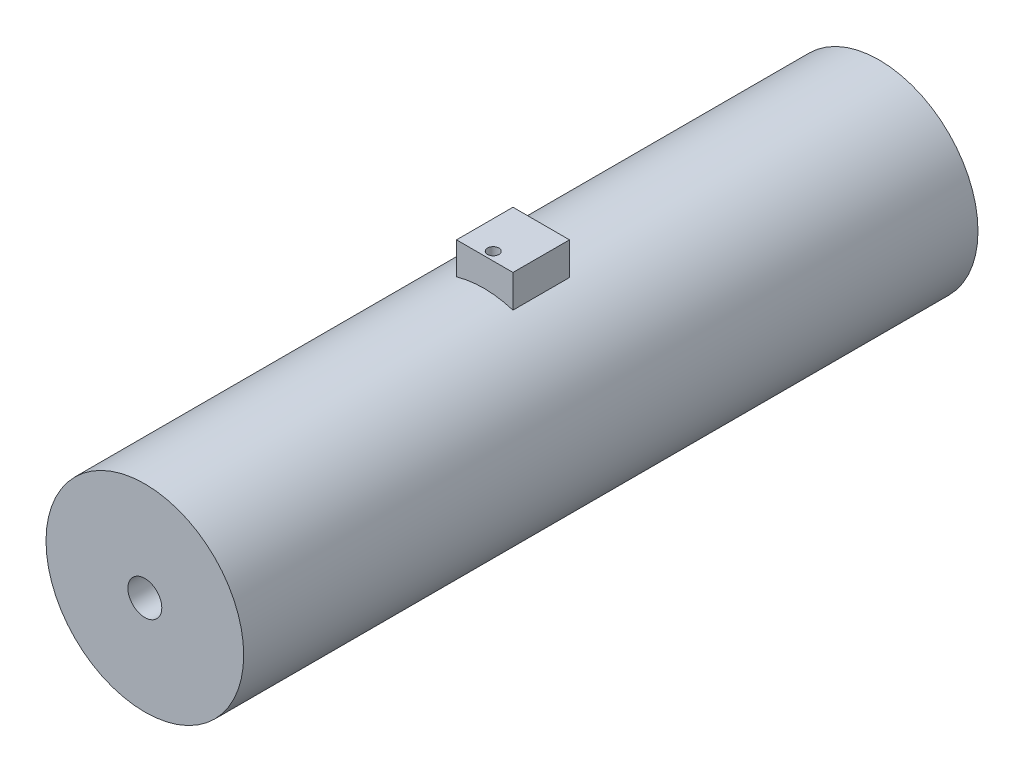
ISO-10303-21;
HEADER;
FILE_DESCRIPTION(('STEP AP214'),'2;1');
FILE_NAME('part.step','',(''),(''),'','','');
FILE_SCHEMA(('AUTOMOTIVE_DESIGN { 1 0 10303 214 1 1 1 1 }'));
ENDSEC;
DATA;
#1=APPLICATION_CONTEXT('core data for automotive mechanical design processes');
#2=APPLICATION_PROTOCOL_DEFINITION('international standard','automotive_design',2000,#1);
#3=PRODUCT_CONTEXT('',#1,'mechanical');
#4=PRODUCT('Part','Part','',(#3));
#5=PRODUCT_RELATED_PRODUCT_CATEGORY('part','',(#4));
#6=PRODUCT_DEFINITION_FORMATION('','',#4);
#7=PRODUCT_DEFINITION_CONTEXT('part definition',#1,'design');
#8=PRODUCT_DEFINITION('design','',#6,#7);
#9=PRODUCT_DEFINITION_SHAPE('','',#8);
#10=(LENGTH_UNIT() NAMED_UNIT(*) SI_UNIT(.MILLI.,.METRE.));
#11=(NAMED_UNIT(*) PLANE_ANGLE_UNIT() SI_UNIT($,.RADIAN.));
#12=(NAMED_UNIT(*) SI_UNIT($,.STERADIAN.) SOLID_ANGLE_UNIT());
#13=UNCERTAINTY_MEASURE_WITH_UNIT(LENGTH_MEASURE(1.E-05),#10,'distance_accuracy_value','');
#14=(GEOMETRIC_REPRESENTATION_CONTEXT(3) GLOBAL_UNCERTAINTY_ASSIGNED_CONTEXT((#13)) GLOBAL_UNIT_ASSIGNED_CONTEXT((#10,
#11,#12)) REPRESENTATION_CONTEXT('',''));
#15=CARTESIAN_POINT('',(0.,0.,0.));
#16=DIRECTION('',(0.,0.,1.));
#17=DIRECTION('',(1.,0.,0.));
#18=AXIS2_PLACEMENT_3D('',#15,#16,#17);
#19=CARTESIAN_POINT('',(0.,0.,-65.));
#20=DIRECTION('',(0.,0.,1.));
#21=DIRECTION('',(1.,0.,0.));
#22=AXIS2_PLACEMENT_3D('',#19,#20,#21);
#23=CYLINDRICAL_SURFACE('',#22,17.5);
#24=CARTESIAN_POINT('',(0.,0.,-65.));
#25=DIRECTION('',(0.,0.,1.));
#26=DIRECTION('',(1.,0.,0.));
#27=AXIS2_PLACEMENT_3D('',#24,#25,#26);
#28=CIRCLE('',#27,17.5);
#29=CARTESIAN_POINT('',(17.5,0.,-65.));
#30=VERTEX_POINT('',#29);
#31=EDGE_CURVE('E114',#30,#30,#28,.T.);
#32=ORIENTED_EDGE('',*,*,#31,.T.);
#33=EDGE_LOOP('',(#32));
#34=FACE_BOUND('',#33,.T.);
#35=CARTESIAN_POINT('',(0.,0.,65.));
#36=DIRECTION('',(0.,0.,1.));
#37=DIRECTION('',(1.,0.,0.));
#38=AXIS2_PLACEMENT_3D('',#35,#36,#37);
#39=CIRCLE('',#38,17.5);
#40=CARTESIAN_POINT('',(17.5,0.,65.));
#41=VERTEX_POINT('',#40);
#42=EDGE_CURVE('E110',#41,#41,#39,.T.);
#43=ORIENTED_EDGE('',*,*,#42,.F.);
#44=EDGE_LOOP('',(#43));
#45=FACE_BOUND('',#44,.T.);
#46=DIRECTION('',(0.,0.,1.));
#47=VECTOR('',#46,1.);
#48=CARTESIAN_POINT('',(-4.82433253220859,16.8218850197793,-65.));
#49=LINE('',#48,#47);
#50=CARTESIAN_POINT('',(-4.82433253220859,16.8218850197793,-5.));
#51=VERTEX_POINT('',#50);
#52=CARTESIAN_POINT('',(-4.82433253220859,16.8218850197793,5.));
#53=VERTEX_POINT('',#52);
#54=EDGE_CURVE('E57',#51,#53,#49,.T.);
#55=ORIENTED_EDGE('',*,*,#54,.F.);
#56=CARTESIAN_POINT('',(0.,0.,-5.));
#57=DIRECTION('',(0.,0.,1.));
#58=DIRECTION('',(1.,0.,0.));
#59=AXIS2_PLACEMENT_3D('',#56,#57,#58);
#60=CIRCLE('',#59,17.5);
#61=CARTESIAN_POINT('',(5.1756674677914,16.7171309219868,-5.));
#62=VERTEX_POINT('',#61);
#63=EDGE_CURVE('E11',#51,#62,#60,.F.);
#64=ORIENTED_EDGE('',*,*,#63,.T.);
#65=DIRECTION('',(0.,0.,1.));
#66=VECTOR('',#65,1.);
#67=CARTESIAN_POINT('',(5.1756674677914,16.7171309219868,-65.));
#68=LINE('',#67,#66);
#69=CARTESIAN_POINT('',(5.1756674677914,16.7171309219868,5.));
#70=VERTEX_POINT('',#69);
#71=EDGE_CURVE('E47',#62,#70,#68,.T.);
#72=ORIENTED_EDGE('',*,*,#71,.T.);
#73=CARTESIAN_POINT('',(0.,0.,5.));
#74=DIRECTION('',(0.,0.,1.));
#75=DIRECTION('',(1.,0.,0.));
#76=AXIS2_PLACEMENT_3D('',#73,#74,#75);
#77=CIRCLE('',#76,17.5);
#78=EDGE_CURVE('E95',#53,#70,#77,.F.);
#79=ORIENTED_EDGE('',*,*,#78,.F.);
#80=EDGE_LOOP('',(#55,#64,#72,#79));
#81=FACE_BOUND('',#80,.T.);
#82=ADVANCED_FACE('F40',(#34,#45,#81),#23,.T.);
#83=CARTESIAN_POINT('',(0.,0.,-65.));
#84=DIRECTION('',(0.,0.,1.));
#85=DIRECTION('',(1.,0.,0.));
#86=AXIS2_PLACEMENT_3D('',#83,#84,#85);
#87=PLANE('',#86);
#88=CARTESIAN_POINT('',(0.,0.,-65.));
#89=DIRECTION('',(0.,0.,1.));
#90=DIRECTION('',(1.,0.,0.));
#91=AXIS2_PLACEMENT_3D('',#88,#89,#90);
#92=CIRCLE('',#91,3.);
#93=CARTESIAN_POINT('',(3.,0.,-65.));
#94=VERTEX_POINT('',#93);
#95=EDGE_CURVE('E158',#94,#94,#92,.T.);
#96=ORIENTED_EDGE('',*,*,#95,.T.);
#97=EDGE_LOOP('',(#96));
#98=FACE_BOUND('',#97,.T.);
#99=ORIENTED_EDGE('',*,*,#31,.F.);
#100=EDGE_LOOP('',(#99));
#101=FACE_BOUND('',#100,.T.);
#102=ADVANCED_FACE('F135',(#98,#101),#87,.F.);
#103=CARTESIAN_POINT('',(0.,0.,65.));
#104=DIRECTION('',(0.,0.,1.));
#105=DIRECTION('',(1.,0.,0.));
#106=AXIS2_PLACEMENT_3D('',#103,#104,#105);
#107=PLANE('',#106);
#108=CARTESIAN_POINT('',(0.,0.,65.));
#109=DIRECTION('',(0.,0.,1.));
#110=DIRECTION('',(1.,0.,0.));
#111=AXIS2_PLACEMENT_3D('',#108,#109,#110);
#112=CIRCLE('',#111,3.);
#113=CARTESIAN_POINT('',(3.,0.,65.));
#114=VERTEX_POINT('',#113);
#115=EDGE_CURVE('E152',#114,#114,#112,.T.);
#116=ORIENTED_EDGE('',*,*,#115,.F.);
#117=EDGE_LOOP('',(#116));
#118=FACE_BOUND('',#117,.T.);
#119=ORIENTED_EDGE('',*,*,#42,.T.);
#120=EDGE_LOOP('',(#119));
#121=FACE_BOUND('',#120,.T.);
#122=ADVANCED_FACE('F131',(#118,#121),#107,.T.);
#123=CARTESIAN_POINT('',(5.17566746779141,0.,-5.));
#124=DIRECTION('',(-1.,0.,0.));
#125=DIRECTION('',(0.,-1.,0.));
#126=AXIS2_PLACEMENT_3D('',#123,#124,#125);
#127=PLANE('',#126);
#128=ORIENTED_EDGE('',*,*,#71,.F.);
#129=DIRECTION('',(0.,-1.,0.));
#130=VECTOR('',#129,1.);
#131=CARTESIAN_POINT('',(5.17566746779141,0.,-5.));
#132=LINE('',#131,#130);
#133=CARTESIAN_POINT('',(5.1756674677914,22.4991182903814,-5.));
#134=VERTEX_POINT('',#133);
#135=EDGE_CURVE('E82',#134,#62,#132,.T.);
#136=ORIENTED_EDGE('',*,*,#135,.F.);
#137=DIRECTION('',(0.,0.,1.));
#138=VECTOR('',#137,1.);
#139=CARTESIAN_POINT('',(5.1756674677914,22.4991182903814,-5.));
#140=LINE('',#139,#138);
#141=CARTESIAN_POINT('',(5.1756674677914,22.4991182903814,5.));
#142=VERTEX_POINT('',#141);
#143=EDGE_CURVE('E77',#134,#142,#140,.T.);
#144=ORIENTED_EDGE('',*,*,#143,.T.);
#145=DIRECTION('',(0.,-1.,0.));
#146=VECTOR('',#145,1.);
#147=CARTESIAN_POINT('',(5.17566746779141,0.,5.));
#148=LINE('',#147,#146);
#149=EDGE_CURVE('E80',#142,#70,#148,.T.);
#150=ORIENTED_EDGE('',*,*,#149,.T.);
#151=EDGE_LOOP('',(#128,#136,#144,#150));
#152=FACE_BOUND('',#151,.T.);
#153=ADVANCED_FACE('F79',(#152),#127,.F.);
#154=CARTESIAN_POINT('',(-4.8243325322086,0.,-5.));
#155=DIRECTION('',(-1.,0.,0.));
#156=DIRECTION('',(0.,-1.,0.));
#157=AXIS2_PLACEMENT_3D('',#154,#155,#156);
#158=PLANE('',#157);
#159=DIRECTION('',(0.,-1.,0.));
#160=VECTOR('',#159,1.);
#161=CARTESIAN_POINT('',(-4.8243325322086,0.,-5.));
#162=LINE('',#161,#160);
#163=CARTESIAN_POINT('',(-4.82433253220859,22.4991182903814,-5.));
#164=VERTEX_POINT('',#163);
#165=EDGE_CURVE('E87',#164,#51,#162,.T.);
#166=ORIENTED_EDGE('',*,*,#165,.T.);
#167=ORIENTED_EDGE('',*,*,#54,.T.);
#168=DIRECTION('',(0.,-1.,0.));
#169=VECTOR('',#168,1.);
#170=CARTESIAN_POINT('',(-4.8243325322086,0.,5.));
#171=LINE('',#170,#169);
#172=CARTESIAN_POINT('',(-4.82433253220859,22.4991182903814,5.));
#173=VERTEX_POINT('',#172);
#174=EDGE_CURVE('E100',#173,#53,#171,.T.);
#175=ORIENTED_EDGE('',*,*,#174,.F.);
#176=DIRECTION('',(0.,0.,1.));
#177=VECTOR('',#176,1.);
#178=CARTESIAN_POINT('',(-4.82433253220859,22.4991182903814,-5.));
#179=LINE('',#178,#177);
#180=EDGE_CURVE('E86',#164,#173,#179,.T.);
#181=ORIENTED_EDGE('',*,*,#180,.F.);
#182=EDGE_LOOP('',(#166,#167,#175,#181));
#183=FACE_BOUND('',#182,.T.);
#184=ADVANCED_FACE('F122',(#183),#158,.T.);
#185=CARTESIAN_POINT('',(0.,22.4991182903814,-5.));
#186=DIRECTION('',(0.,-1.,0.));
#187=DIRECTION('',(0.,0.,-1.));
#188=AXIS2_PLACEMENT_3D('',#185,#186,#187);
#189=PLANE('',#188);
#190=CARTESIAN_POINT('',(0.175667467791405,22.4991182903814,3.5));
#191=DIRECTION('',(0.,1.,0.));
#192=DIRECTION('',(0.,0.,1.));
#193=AXIS2_PLACEMENT_3D('',#190,#191,#192);
#194=CIRCLE('',#193,1.);
#195=CARTESIAN_POINT('',(0.175667467791405,22.4991182903814,4.5));
#196=VERTEX_POINT('',#195);
#197=EDGE_CURVE('E164',#196,#196,#194,.T.);
#198=ORIENTED_EDGE('',*,*,#197,.F.);
#199=EDGE_LOOP('',(#198));
#200=FACE_BOUND('',#199,.T.);
#201=ORIENTED_EDGE('',*,*,#180,.T.);
#202=DIRECTION('',(1.,0.,0.));
#203=VECTOR('',#202,1.);
#204=CARTESIAN_POINT('',(0.,22.4991182903814,5.));
#205=LINE('',#204,#203);
#206=EDGE_CURVE('E94',#173,#142,#205,.T.);
#207=ORIENTED_EDGE('',*,*,#206,.T.);
#208=ORIENTED_EDGE('',*,*,#143,.F.);
#209=DIRECTION('',(1.,0.,0.));
#210=VECTOR('',#209,1.);
#211=CARTESIAN_POINT('',(0.,22.4991182903814,-5.));
#212=LINE('',#211,#210);
#213=EDGE_CURVE('E106',#164,#134,#212,.T.);
#214=ORIENTED_EDGE('',*,*,#213,.F.);
#215=EDGE_LOOP('',(#201,#207,#208,#214));
#216=FACE_BOUND('',#215,.T.);
#217=ADVANCED_FACE('F98',(#200,#216),#189,.F.);
#218=CARTESIAN_POINT('',(0.,0.,-5.));
#219=DIRECTION('',(0.,0.,1.));
#220=DIRECTION('',(1.,0.,0.));
#221=AXIS2_PLACEMENT_3D('',#218,#219,#220);
#222=PLANE('',#221);
#223=ORIENTED_EDGE('',*,*,#63,.F.);
#224=ORIENTED_EDGE('',*,*,#165,.F.);
#225=ORIENTED_EDGE('',*,*,#213,.T.);
#226=ORIENTED_EDGE('',*,*,#135,.T.);
#227=EDGE_LOOP('',(#223,#224,#225,#226));
#228=FACE_BOUND('',#227,.T.);
#229=ADVANCED_FACE('F119',(#228),#222,.F.);
#230=CARTESIAN_POINT('',(0.,0.,5.));
#231=DIRECTION('',(0.,0.,1.));
#232=DIRECTION('',(1.,0.,0.));
#233=AXIS2_PLACEMENT_3D('',#230,#231,#232);
#234=PLANE('',#233);
#235=ORIENTED_EDGE('',*,*,#174,.T.);
#236=ORIENTED_EDGE('',*,*,#78,.T.);
#237=ORIENTED_EDGE('',*,*,#149,.F.);
#238=ORIENTED_EDGE('',*,*,#206,.F.);
#239=EDGE_LOOP('',(#235,#236,#237,#238));
#240=FACE_BOUND('',#239,.T.);
#241=ADVANCED_FACE('F93',(#240),#234,.T.);
#242=CARTESIAN_POINT('',(0.,0.,50.));
#243=DIRECTION('',(0.,0.,1.));
#244=DIRECTION('',(1.,0.,0.));
#245=AXIS2_PLACEMENT_3D('',#242,#243,#244);
#246=CYLINDRICAL_SURFACE('',#245,3.);
#247=CARTESIAN_POINT('',(0.,0.,50.));
#248=DIRECTION('',(0.,0.,1.));
#249=DIRECTION('',(1.,0.,0.));
#250=AXIS2_PLACEMENT_3D('',#247,#248,#249);
#251=CIRCLE('',#250,3.);
#252=CARTESIAN_POINT('',(3.,0.,50.));
#253=VERTEX_POINT('',#252);
#254=EDGE_CURVE('E96',#253,#253,#251,.T.);
#255=ORIENTED_EDGE('',*,*,#254,.F.);
#256=EDGE_LOOP('',(#255));
#257=FACE_BOUND('',#256,.T.);
#258=ORIENTED_EDGE('',*,*,#115,.T.);
#259=EDGE_LOOP('',(#258));
#260=FACE_BOUND('',#259,.T.);
#261=ADVANCED_FACE('F193',(#257,#260),#246,.F.);
#262=CARTESIAN_POINT('',(0.,0.,50.));
#263=DIRECTION('',(0.,0.,1.));
#264=DIRECTION('',(1.,0.,0.));
#265=AXIS2_PLACEMENT_3D('',#262,#263,#264);
#266=PLANE('',#265);
#267=ORIENTED_EDGE('',*,*,#254,.T.);
#268=EDGE_LOOP('',(#267));
#269=FACE_BOUND('',#268,.T.);
#270=ADVANCED_FACE('F189',(#269),#266,.T.);
#271=CARTESIAN_POINT('',(0.,0.,-50.));
#272=DIRECTION('',(0.,0.,-1.));
#273=DIRECTION('',(-1.,0.,0.));
#274=AXIS2_PLACEMENT_3D('',#271,#272,#273);
#275=CYLINDRICAL_SURFACE('',#274,3.);
#276=CARTESIAN_POINT('',(0.,0.,-50.));
#277=DIRECTION('',(0.,0.,1.));
#278=DIRECTION('',(1.,0.,0.));
#279=AXIS2_PLACEMENT_3D('',#276,#277,#278);
#280=CIRCLE('',#279,3.);
#281=CARTESIAN_POINT('',(3.,0.,-50.));
#282=VERTEX_POINT('',#281);
#283=EDGE_CURVE('E154',#282,#282,#280,.T.);
#284=ORIENTED_EDGE('',*,*,#283,.T.);
#285=EDGE_LOOP('',(#284));
#286=FACE_BOUND('',#285,.T.);
#287=ORIENTED_EDGE('',*,*,#95,.F.);
#288=EDGE_LOOP('',(#287));
#289=FACE_BOUND('',#288,.T.);
#290=ADVANCED_FACE('F183',(#286,#289),#275,.F.);
#291=CARTESIAN_POINT('',(0.,0.,-50.));
#292=DIRECTION('',(0.,0.,-1.));
#293=DIRECTION('',(1.,0.,0.));
#294=AXIS2_PLACEMENT_3D('',#291,#292,#293);
#295=PLANE('',#294);
#296=ORIENTED_EDGE('',*,*,#283,.F.);
#297=EDGE_LOOP('',(#296));
#298=FACE_BOUND('',#297,.T.);
#299=ADVANCED_FACE('F175',(#298),#295,.T.);
#300=CARTESIAN_POINT('',(0.175667467791405,12.4991182903814,3.5));
#301=DIRECTION('',(0.,1.,0.));
#302=DIRECTION('',(0.,0.,1.));
#303=AXIS2_PLACEMENT_3D('',#300,#301,#302);
#304=CYLINDRICAL_SURFACE('',#303,1.);
#305=CARTESIAN_POINT('',(0.175667467791405,12.4991182903814,3.5));
#306=DIRECTION('',(0.,1.,0.));
#307=DIRECTION('',(0.,0.,1.));
#308=AXIS2_PLACEMENT_3D('',#305,#306,#307);
#309=CIRCLE('',#308,1.);
#310=CARTESIAN_POINT('',(0.175667467791405,12.4991182903814,4.5));
#311=VERTEX_POINT('',#310);
#312=EDGE_CURVE('E162',#311,#311,#309,.T.);
#313=ORIENTED_EDGE('',*,*,#312,.F.);
#314=EDGE_LOOP('',(#313));
#315=FACE_BOUND('',#314,.T.);
#316=ORIENTED_EDGE('',*,*,#197,.T.);
#317=EDGE_LOOP('',(#316));
#318=FACE_BOUND('',#317,.T.);
#319=ADVANCED_FACE('F172',(#315,#318),#304,.F.);
#320=CARTESIAN_POINT('',(0.175667467791405,12.4991182903814,3.5));
#321=DIRECTION('',(0.,1.,0.));
#322=DIRECTION('',(0.,0.,1.));
#323=AXIS2_PLACEMENT_3D('',#320,#321,#322);
#324=PLANE('',#323);
#325=ORIENTED_EDGE('',*,*,#312,.T.);
#326=EDGE_LOOP('',(#325));
#327=FACE_BOUND('',#326,.T.);
#328=ADVANCED_FACE('F170',(#327),#324,.T.);
#329=CLOSED_SHELL('',(#82,#102,#122,#153,#184,#217,#229,#241,#261,#270,#290,#299,#319,#328));
#330=MANIFOLD_SOLID_BREP('B2',#329);
#331=ADVANCED_BREP_SHAPE_REPRESENTATION('',(#18,#330),#14);
#332=SHAPE_DEFINITION_REPRESENTATION(#9,#331);
ENDSEC;
END-ISO-10303-21;
